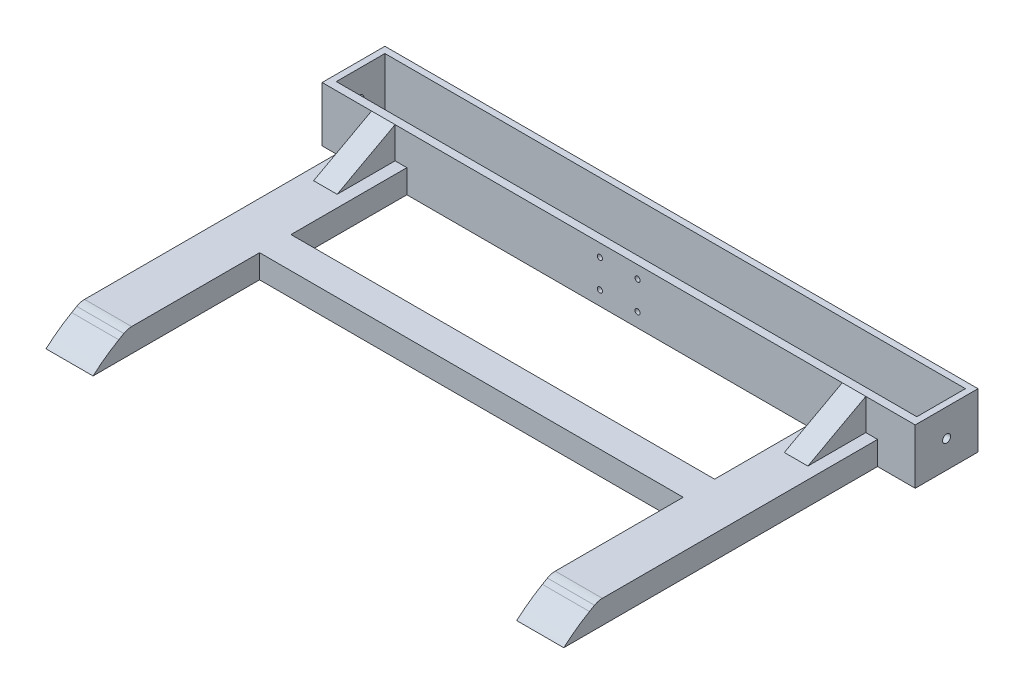
ISO-10303-21;
HEADER;
FILE_DESCRIPTION(('STEP AP214'),'2;1');
FILE_NAME('part.step','',(''),(''),'','','');
FILE_SCHEMA(('AUTOMOTIVE_DESIGN { 1 0 10303 214 1 1 1 1 }'));
ENDSEC;
DATA;
#1=APPLICATION_CONTEXT('core data for automotive mechanical design processes');
#2=APPLICATION_PROTOCOL_DEFINITION('international standard','automotive_design',2000,#1);
#3=PRODUCT_CONTEXT('',#1,'mechanical');
#4=PRODUCT('Part','Part','',(#3));
#5=PRODUCT_RELATED_PRODUCT_CATEGORY('part','',(#4));
#6=PRODUCT_DEFINITION_FORMATION('','',#4);
#7=PRODUCT_DEFINITION_CONTEXT('part definition',#1,'design');
#8=PRODUCT_DEFINITION('design','',#6,#7);
#9=PRODUCT_DEFINITION_SHAPE('','',#8);
#10=(LENGTH_UNIT() NAMED_UNIT(*) SI_UNIT(.MILLI.,.METRE.));
#11=(NAMED_UNIT(*) PLANE_ANGLE_UNIT() SI_UNIT($,.RADIAN.));
#12=(NAMED_UNIT(*) SI_UNIT($,.STERADIAN.) SOLID_ANGLE_UNIT());
#13=UNCERTAINTY_MEASURE_WITH_UNIT(LENGTH_MEASURE(1.E-05),#10,'distance_accuracy_value','');
#14=(GEOMETRIC_REPRESENTATION_CONTEXT(3) GLOBAL_UNCERTAINTY_ASSIGNED_CONTEXT((#13)) GLOBAL_UNIT_ASSIGNED_CONTEXT((#10,
#11,#12)) REPRESENTATION_CONTEXT('',''));
#15=CARTESIAN_POINT('',(0.,0.,0.));
#16=DIRECTION('',(0.,0.,1.));
#17=DIRECTION('',(1.,0.,0.));
#18=AXIS2_PLACEMENT_3D('',#15,#16,#17);
#19=CARTESIAN_POINT('',(0.,0.,2.5));
#20=DIRECTION('',(0.,0.,1.));
#21=DIRECTION('',(1.,0.,0.));
#22=AXIS2_PLACEMENT_3D('',#19,#20,#21);
#23=PLANE('',#22);
#24=CARTESIAN_POINT('',(-12.,9.,2.5));
#25=DIRECTION('',(0.,0.,1.));
#26=DIRECTION('',(1.,0.,0.));
#27=AXIS2_PLACEMENT_3D('',#24,#25,#26);
#28=CIRCLE('',#27,1.65);
#29=CARTESIAN_POINT('',(-10.35,9.,2.5));
#30=VERTEX_POINT('',#29);
#31=EDGE_CURVE('E357',#30,#30,#28,.T.);
#32=ORIENTED_EDGE('',*,*,#31,.F.);
#33=EDGE_LOOP('',(#32));
#34=FACE_BOUND('',#33,.T.);
#35=CARTESIAN_POINT('',(-12.,27.,2.5));
#36=DIRECTION('',(0.,0.,1.));
#37=DIRECTION('',(1.,0.,0.));
#38=AXIS2_PLACEMENT_3D('',#35,#36,#37);
#39=CIRCLE('',#38,1.65);
#40=CARTESIAN_POINT('',(-10.35,27.,2.5));
#41=VERTEX_POINT('',#40);
#42=EDGE_CURVE('E382',#41,#41,#39,.T.);
#43=ORIENTED_EDGE('',*,*,#42,.F.);
#44=EDGE_LOOP('',(#43));
#45=FACE_BOUND('',#44,.T.);
#46=CARTESIAN_POINT('',(12.,9.,2.5));
#47=DIRECTION('',(0.,0.,1.));
#48=DIRECTION('',(1.,0.,0.));
#49=AXIS2_PLACEMENT_3D('',#46,#47,#48);
#50=CIRCLE('',#49,1.65);
#51=CARTESIAN_POINT('',(13.65,9.,2.5));
#52=VERTEX_POINT('',#51);
#53=EDGE_CURVE('E388',#52,#52,#50,.T.);
#54=ORIENTED_EDGE('',*,*,#53,.F.);
#55=EDGE_LOOP('',(#54));
#56=FACE_BOUND('',#55,.T.);
#57=CARTESIAN_POINT('',(12.,27.,2.5));
#58=DIRECTION('',(0.,0.,1.));
#59=DIRECTION('',(1.,0.,0.));
#60=AXIS2_PLACEMENT_3D('',#57,#58,#59);
#61=CIRCLE('',#60,1.65);
#62=CARTESIAN_POINT('',(13.65,27.,2.5));
#63=VERTEX_POINT('',#62);
#64=EDGE_CURVE('E394',#63,#63,#61,.T.);
#65=ORIENTED_EDGE('',*,*,#64,.F.);
#66=EDGE_LOOP('',(#65));
#67=FACE_BOUND('',#66,.T.);
#68=DIRECTION('',(-1.,0.,0.));
#69=VECTOR('',#68,1.);
#70=CARTESIAN_POINT('',(189.,35.0000000000001,2.5));
#71=LINE('',#70,#69);
#72=CARTESIAN_POINT('',(142.5,35.0000000000001,2.5));
#73=VERTEX_POINT('',#72);
#74=CARTESIAN_POINT('',(-142.5,35.,2.5));
#75=VERTEX_POINT('',#74);
#76=EDGE_CURVE('E257',#73,#75,#71,.T.);
#77=ORIENTED_EDGE('',*,*,#76,.T.);
#78=DIRECTION('',(0.,-1.,0.));
#79=VECTOR('',#78,1.);
#80=CARTESIAN_POINT('',(-142.5,0.,2.5));
#81=LINE('',#80,#79);
#82=CARTESIAN_POINT('',(-142.5,15.,2.5));
#83=VERTEX_POINT('',#82);
#84=EDGE_CURVE('E256',#75,#83,#81,.T.);
#85=ORIENTED_EDGE('',*,*,#84,.T.);
#86=DIRECTION('',(-1.,0.,0.));
#87=VECTOR('',#86,1.);
#88=CARTESIAN_POINT('',(-135.,15.,2.5));
#89=LINE('',#88,#87);
#90=CARTESIAN_POINT('',(-135.,15.,2.5));
#91=VERTEX_POINT('',#90);
#92=EDGE_CURVE('E240',#91,#83,#89,.T.);
#93=ORIENTED_EDGE('',*,*,#92,.F.);
#94=DIRECTION('',(0.,1.,0.));
#95=VECTOR('',#94,1.);
#96=CARTESIAN_POINT('',(-135.,15.,2.5));
#97=LINE('',#96,#95);
#98=CARTESIAN_POINT('',(-135.,0.,2.5));
#99=VERTEX_POINT('',#98);
#100=EDGE_CURVE('E370',#99,#91,#97,.T.);
#101=ORIENTED_EDGE('',*,*,#100,.F.);
#102=DIRECTION('',(1.,0.,0.));
#103=VECTOR('',#102,1.);
#104=CARTESIAN_POINT('',(-189.,0.,2.5));
#105=LINE('',#104,#103);
#106=CARTESIAN_POINT('',(135.,0.,2.5));
#107=VERTEX_POINT('',#106);
#108=EDGE_CURVE('E451',#99,#107,#105,.T.);
#109=ORIENTED_EDGE('',*,*,#108,.T.);
#110=DIRECTION('',(0.,-1.,0.));
#111=VECTOR('',#110,1.);
#112=CARTESIAN_POINT('',(135.,15.,2.5));
#113=LINE('',#112,#111);
#114=CARTESIAN_POINT('',(135.,15.,2.5));
#115=VERTEX_POINT('',#114);
#116=EDGE_CURVE('E337',#115,#107,#113,.T.);
#117=ORIENTED_EDGE('',*,*,#116,.F.);
#118=DIRECTION('',(-1.,0.,0.));
#119=VECTOR('',#118,1.);
#120=CARTESIAN_POINT('',(135.,15.,2.5));
#121=LINE('',#120,#119);
#122=CARTESIAN_POINT('',(142.5,15.,2.5));
#123=VERTEX_POINT('',#122);
#124=EDGE_CURVE('E340',#123,#115,#121,.T.);
#125=ORIENTED_EDGE('',*,*,#124,.F.);
#126=DIRECTION('',(0.,1.,0.));
#127=VECTOR('',#126,1.);
#128=CARTESIAN_POINT('',(142.5,0.,2.5));
#129=LINE('',#128,#127);
#130=EDGE_CURVE('E283',#123,#73,#129,.T.);
#131=ORIENTED_EDGE('',*,*,#130,.T.);
#132=EDGE_LOOP('',(#77,#85,#93,#101,#109,#117,#125,#131));
#133=FACE_BOUND('',#132,.T.);
#134=ADVANCED_FACE('F43',(#34,#45,#56,#67,#133),#23,.T.);
#135=DIRECTION('',(0.,-1.,0.));
#136=VECTOR('',#135,1.);
#137=CARTESIAN_POINT('',(-157.5,0.,2.5));
#138=LINE('',#137,#136);
#139=CARTESIAN_POINT('',(-157.5,35.,2.5));
#140=VERTEX_POINT('',#139);
#141=CARTESIAN_POINT('',(-157.5,15.,2.5));
#142=VERTEX_POINT('',#141);
#143=EDGE_CURVE('E58',#140,#142,#138,.T.);
#144=ORIENTED_EDGE('',*,*,#143,.F.);
#145=CARTESIAN_POINT('',(-189.,35.,2.5));
#146=VERTEX_POINT('',#145);
#147=EDGE_CURVE('E440',#140,#146,#71,.T.);
#148=ORIENTED_EDGE('',*,*,#147,.T.);
#149=DIRECTION('',(0.,-1.,0.));
#150=VECTOR('',#149,1.);
#151=CARTESIAN_POINT('',(-189.,0.,2.5));
#152=LINE('',#151,#150);
#153=CARTESIAN_POINT('',(-189.,0.,2.5));
#154=VERTEX_POINT('',#153);
#155=EDGE_CURVE('E445',#146,#154,#152,.T.);
#156=ORIENTED_EDGE('',*,*,#155,.T.);
#157=CARTESIAN_POINT('',(-165.,0.,2.5));
#158=VERTEX_POINT('',#157);
#159=EDGE_CURVE('E448',#154,#158,#105,.T.);
#160=ORIENTED_EDGE('',*,*,#159,.T.);
#161=DIRECTION('',(0.,-1.,0.));
#162=VECTOR('',#161,1.);
#163=CARTESIAN_POINT('',(-165.,15.,2.5));
#164=LINE('',#163,#162);
#165=CARTESIAN_POINT('',(-165.,15.,2.5));
#166=VERTEX_POINT('',#165);
#167=EDGE_CURVE('E372',#166,#158,#164,.T.);
#168=ORIENTED_EDGE('',*,*,#167,.F.);
#169=EDGE_CURVE('E253',#142,#166,#89,.T.);
#170=ORIENTED_EDGE('',*,*,#169,.F.);
#171=EDGE_LOOP('',(#144,#148,#156,#160,#168,#170));
#172=FACE_BOUND('',#171,.T.);
#173=ADVANCED_FACE('F528',(#172),#23,.T.);
#174=CARTESIAN_POINT('',(-135.,15.,202.5));
#175=DIRECTION('',(-1.,0.,0.));
#176=DIRECTION('',(0.,0.,1.));
#177=AXIS2_PLACEMENT_3D('',#174,#175,#176);
#178=PLANE('',#177);
#179=DIRECTION('',(0.,0.,-1.));
#180=VECTOR('',#179,1.);
#181=CARTESIAN_POINT('',(-135.,15.,202.5));
#182=LINE('',#181,#180);
#183=CARTESIAN_POINT('',(-135.,15.,177.914075148194));
#184=VERTEX_POINT('',#183);
#185=CARTESIAN_POINT('',(-135.,15.,96.3824172216684));
#186=VERTEX_POINT('',#185);
#187=EDGE_CURVE('E367',#184,#186,#182,.T.);
#188=ORIENTED_EDGE('',*,*,#187,.F.);
#189=CARTESIAN_POINT('',(-135.,5.00000000000003,177.914075148194));
#190=DIRECTION('',(-1.,0.,0.));
#191=DIRECTION('',(0.,0.,1.));
#192=AXIS2_PLACEMENT_3D('',#189,#190,#191);
#193=CIRCLE('',#192,10.);
#194=CARTESIAN_POINT('',(-135.,13.6602540378445,182.914075148194));
#195=VERTEX_POINT('',#194);
#196=EDGE_CURVE('E488',#184,#195,#193,.F.);
#197=ORIENTED_EDGE('',*,*,#196,.T.);
#198=DIRECTION('',(0.,0.499999999999995,-0.866025403784442));
#199=VECTOR('',#198,1.);
#200=CARTESIAN_POINT('',(-135.,5.51423628924494,197.023391768126));
#201=LINE('',#200,#199);
#202=CARTESIAN_POINT('',(-135.,11.8051884231915,186.127143044147));
#203=VERTEX_POINT('',#202);
#204=EDGE_CURVE('E300',#203,#195,#201,.T.);
#205=ORIENTED_EDGE('',*,*,#204,.F.);
#206=CARTESIAN_POINT('',(-135.,-74.7973519552528,136.127143044148));
#207=DIRECTION('',(-1.,0.,0.));
#208=DIRECTION('',(0.,0.,1.));
#209=AXIS2_PLACEMENT_3D('',#206,#207,#208);
#210=CIRCLE('',#209,100.);
#211=CARTESIAN_POINT('',(-135.,0.,202.5));
#212=VERTEX_POINT('',#211);
#213=EDGE_CURVE('E469',#203,#212,#210,.F.);
#214=ORIENTED_EDGE('',*,*,#213,.T.);
#215=DIRECTION('',(0.,0.,-1.));
#216=VECTOR('',#215,1.);
#217=CARTESIAN_POINT('',(-135.,0.,202.5));
#218=LINE('',#217,#216);
#219=CARTESIAN_POINT('',(-135.,0.,96.3824172216684));
#220=VERTEX_POINT('',#219);
#221=EDGE_CURVE('E364',#212,#220,#218,.T.);
#222=ORIENTED_EDGE('',*,*,#221,.T.);
#223=DIRECTION('',(0.,-1.,0.));
#224=VECTOR('',#223,1.);
#225=CARTESIAN_POINT('',(-135.,15.,96.3824172216684));
#226=LINE('',#225,#224);
#227=EDGE_CURVE('E316',#186,#220,#226,.T.);
#228=ORIENTED_EDGE('',*,*,#227,.F.);
#229=EDGE_LOOP('',(#188,#197,#205,#214,#222,#228));
#230=FACE_BOUND('',#229,.T.);
#231=ADVANCED_FACE('F534',(#230),#178,.F.);
#232=CARTESIAN_POINT('',(135.,15.,202.5));
#233=DIRECTION('',(1.,0.,0.));
#234=DIRECTION('',(0.,0.,-1.));
#235=AXIS2_PLACEMENT_3D('',#232,#233,#234);
#236=PLANE('',#235);
#237=DIRECTION('',(0.,-0.499999999999995,0.866025403784442));
#238=VECTOR('',#237,1.);
#239=CARTESIAN_POINT('',(135.,5.51423628924494,197.023391768126));
#240=LINE('',#239,#238);
#241=CARTESIAN_POINT('',(135.,13.6602540378445,182.914075148194));
#242=VERTEX_POINT('',#241);
#243=CARTESIAN_POINT('',(135.,11.8051884231915,186.127143044147));
#244=VERTEX_POINT('',#243);
#245=EDGE_CURVE('E298',#242,#244,#240,.T.);
#246=ORIENTED_EDGE('',*,*,#245,.F.);
#247=CARTESIAN_POINT('',(135.,5.00000000000003,177.914075148194));
#248=DIRECTION('',(1.,0.,0.));
#249=DIRECTION('',(0.,0.,-1.));
#250=AXIS2_PLACEMENT_3D('',#247,#248,#249);
#251=CIRCLE('',#250,10.);
#252=CARTESIAN_POINT('',(135.,15.,177.914075148194));
#253=VERTEX_POINT('',#252);
#254=EDGE_CURVE('E498',#242,#253,#251,.F.);
#255=ORIENTED_EDGE('',*,*,#254,.T.);
#256=DIRECTION('',(0.,0.,-1.));
#257=VECTOR('',#256,1.);
#258=CARTESIAN_POINT('',(135.,15.,202.5));
#259=LINE('',#258,#257);
#260=CARTESIAN_POINT('',(135.,15.,96.3824172216684));
#261=VERTEX_POINT('',#260);
#262=EDGE_CURVE('E353',#253,#261,#259,.T.);
#263=ORIENTED_EDGE('',*,*,#262,.T.);
#264=DIRECTION('',(0.,-1.,0.));
#265=VECTOR('',#264,1.);
#266=CARTESIAN_POINT('',(135.,15.,96.3824172216684));
#267=LINE('',#266,#265);
#268=CARTESIAN_POINT('',(135.,0.,96.3824172216684));
#269=VERTEX_POINT('',#268);
#270=EDGE_CURVE('E324',#261,#269,#267,.T.);
#271=ORIENTED_EDGE('',*,*,#270,.T.);
#272=DIRECTION('',(0.,0.,-1.));
#273=VECTOR('',#272,1.);
#274=CARTESIAN_POINT('',(135.,0.,202.5));
#275=LINE('',#274,#273);
#276=CARTESIAN_POINT('',(135.,0.,202.5));
#277=VERTEX_POINT('',#276);
#278=EDGE_CURVE('E349',#277,#269,#275,.T.);
#279=ORIENTED_EDGE('',*,*,#278,.F.);
#280=CARTESIAN_POINT('',(135.,-74.7973519552527,136.127143044148));
#281=DIRECTION('',(1.,0.,0.));
#282=DIRECTION('',(0.,0.,-1.));
#283=AXIS2_PLACEMENT_3D('',#280,#281,#282);
#284=CIRCLE('',#283,100.);
#285=EDGE_CURVE('E479',#277,#244,#284,.F.);
#286=ORIENTED_EDGE('',*,*,#285,.T.);
#287=EDGE_LOOP('',(#246,#255,#263,#271,#279,#286));
#288=FACE_BOUND('',#287,.T.);
#289=ADVANCED_FACE('F694',(#288),#236,.F.);
#290=CARTESIAN_POINT('',(-165.,15.,202.5));
#291=DIRECTION('',(1.,0.,0.));
#292=DIRECTION('',(0.,0.,-1.));
#293=AXIS2_PLACEMENT_3D('',#290,#291,#292);
#294=PLANE('',#293);
#295=DIRECTION('',(0.,-0.499999999999995,0.866025403784442));
#296=VECTOR('',#295,1.);
#297=CARTESIAN_POINT('',(-165.,5.51423628924494,197.023391768126));
#298=LINE('',#297,#296);
#299=CARTESIAN_POINT('',(-165.,13.6602540378445,182.914075148194));
#300=VERTEX_POINT('',#299);
#301=CARTESIAN_POINT('',(-165.,11.8051884231915,186.127143044147));
#302=VERTEX_POINT('',#301);
#303=EDGE_CURVE('E296',#300,#302,#298,.T.);
#304=ORIENTED_EDGE('',*,*,#303,.F.);
#305=CARTESIAN_POINT('',(-165.,5.00000000000003,177.914075148194));
#306=DIRECTION('',(1.,0.,0.));
#307=DIRECTION('',(0.,0.,-1.));
#308=AXIS2_PLACEMENT_3D('',#305,#306,#307);
#309=CIRCLE('',#308,10.);
#310=CARTESIAN_POINT('',(-165.,15.,177.914075148194));
#311=VERTEX_POINT('',#310);
#312=EDGE_CURVE('E492',#300,#311,#309,.F.);
#313=ORIENTED_EDGE('',*,*,#312,.T.);
#314=DIRECTION('',(0.,0.,-1.));
#315=VECTOR('',#314,1.);
#316=CARTESIAN_POINT('',(-165.,15.,202.5));
#317=LINE('',#316,#315);
#318=EDGE_CURVE('E320',#311,#166,#317,.T.);
#319=ORIENTED_EDGE('',*,*,#318,.T.);
#320=ORIENTED_EDGE('',*,*,#167,.T.);
#321=DIRECTION('',(0.,0.,-1.));
#322=VECTOR('',#321,1.);
#323=CARTESIAN_POINT('',(-165.,0.,202.5));
#324=LINE('',#323,#322);
#325=CARTESIAN_POINT('',(-165.,0.,202.5));
#326=VERTEX_POINT('',#325);
#327=EDGE_CURVE('E360',#326,#158,#324,.T.);
#328=ORIENTED_EDGE('',*,*,#327,.F.);
#329=CARTESIAN_POINT('',(-165.,-74.7973519552528,136.127143044148));
#330=DIRECTION('',(1.,0.,0.));
#331=DIRECTION('',(0.,0.,-1.));
#332=AXIS2_PLACEMENT_3D('',#329,#330,#331);
#333=CIRCLE('',#332,100.);
#334=EDGE_CURVE('E471',#326,#302,#333,.F.);
#335=ORIENTED_EDGE('',*,*,#334,.T.);
#336=EDGE_LOOP('',(#304,#313,#319,#320,#328,#335));
#337=FACE_BOUND('',#336,.T.);
#338=ADVANCED_FACE('F590',(#337),#294,.F.);
#339=CARTESIAN_POINT('',(165.,15.,202.5));
#340=DIRECTION('',(-1.,0.,0.));
#341=DIRECTION('',(0.,0.,1.));
#342=AXIS2_PLACEMENT_3D('',#339,#340,#341);
#343=PLANE('',#342);
#344=DIRECTION('',(0.,0.,-1.));
#345=VECTOR('',#344,1.);
#346=CARTESIAN_POINT('',(165.,15.,202.5));
#347=LINE('',#346,#345);
#348=CARTESIAN_POINT('',(165.,15.,177.914075148194));
#349=VERTEX_POINT('',#348);
#350=CARTESIAN_POINT('',(165.,15.,2.5));
#351=VERTEX_POINT('',#350);
#352=EDGE_CURVE('E355',#349,#351,#347,.T.);
#353=ORIENTED_EDGE('',*,*,#352,.F.);
#354=CARTESIAN_POINT('',(165.,5.00000000000003,177.914075148194));
#355=DIRECTION('',(-1.,0.,0.));
#356=DIRECTION('',(0.,0.,1.));
#357=AXIS2_PLACEMENT_3D('',#354,#355,#356);
#358=CIRCLE('',#357,10.);
#359=CARTESIAN_POINT('',(165.,13.6602540378445,182.914075148194));
#360=VERTEX_POINT('',#359);
#361=EDGE_CURVE('E494',#349,#360,#358,.F.);
#362=ORIENTED_EDGE('',*,*,#361,.T.);
#363=DIRECTION('',(0.,0.499999999999995,-0.866025403784442));
#364=VECTOR('',#363,1.);
#365=CARTESIAN_POINT('',(165.,5.51423628924494,197.023391768126));
#366=LINE('',#365,#364);
#367=CARTESIAN_POINT('',(165.,11.8051884231915,186.127143044147));
#368=VERTEX_POINT('',#367);
#369=EDGE_CURVE('E293',#368,#360,#366,.T.);
#370=ORIENTED_EDGE('',*,*,#369,.F.);
#371=CARTESIAN_POINT('',(165.,-74.7973519552527,136.127143044148));
#372=DIRECTION('',(-1.,0.,0.));
#373=DIRECTION('',(0.,0.,1.));
#374=AXIS2_PLACEMENT_3D('',#371,#372,#373);
#375=CIRCLE('',#374,100.);
#376=CARTESIAN_POINT('',(165.,0.,202.5));
#377=VERTEX_POINT('',#376);
#378=EDGE_CURVE('E477',#368,#377,#375,.F.);
#379=ORIENTED_EDGE('',*,*,#378,.T.);
#380=DIRECTION('',(0.,0.,-1.));
#381=VECTOR('',#380,1.);
#382=CARTESIAN_POINT('',(165.,0.,202.5));
#383=LINE('',#382,#381);
#384=CARTESIAN_POINT('',(165.,0.,2.5));
#385=VERTEX_POINT('',#384);
#386=EDGE_CURVE('E336',#377,#385,#383,.T.);
#387=ORIENTED_EDGE('',*,*,#386,.T.);
#388=DIRECTION('',(0.,1.,0.));
#389=VECTOR('',#388,1.);
#390=CARTESIAN_POINT('',(165.,15.,2.5));
#391=LINE('',#390,#389);
#392=EDGE_CURVE('E252',#385,#351,#391,.T.);
#393=ORIENTED_EDGE('',*,*,#392,.T.);
#394=EDGE_LOOP('',(#353,#362,#370,#379,#387,#393));
#395=FACE_BOUND('',#394,.T.);
#396=ADVANCED_FACE('F715',(#395),#343,.F.);
#397=CARTESIAN_POINT('',(-185.,0.,-37.5));
#398=DIRECTION('',(-1.,0.,0.));
#399=DIRECTION('',(0.,0.,1.));
#400=AXIS2_PLACEMENT_3D('',#397,#398,#399);
#401=PLANE('',#400);
#402=CARTESIAN_POINT('',(-185.,17.5000000000001,-17.5));
#403=DIRECTION('',(-1.,0.,0.));
#404=DIRECTION('',(0.,0.,1.));
#405=AXIS2_PLACEMENT_3D('',#402,#403,#404);
#406=CIRCLE('',#405,2.55);
#407=CARTESIAN_POINT('',(-185.,17.5000000000001,-14.95));
#408=VERTEX_POINT('',#407);
#409=EDGE_CURVE('E407',#408,#408,#406,.T.);
#410=ORIENTED_EDGE('',*,*,#409,.T.);
#411=EDGE_LOOP('',(#410));
#412=FACE_BOUND('',#411,.T.);
#413=DIRECTION('',(0.,1.,0.));
#414=VECTOR('',#413,1.);
#415=CARTESIAN_POINT('',(-185.,0.,-33.5));
#416=LINE('',#415,#414);
#417=CARTESIAN_POINT('',(-185.,0.,-33.5));
#418=VERTEX_POINT('',#417);
#419=CARTESIAN_POINT('',(-185.,35.0000000000001,-33.5));
#420=VERTEX_POINT('',#419);
#421=EDGE_CURVE('E310',#418,#420,#416,.T.);
#422=ORIENTED_EDGE('',*,*,#421,.T.);
#423=DIRECTION('',(0.,0.,1.));
#424=VECTOR('',#423,1.);
#425=CARTESIAN_POINT('',(-185.,35.0000000000001,-37.5));
#426=LINE('',#425,#424);
#427=CARTESIAN_POINT('',(-185.,35.,-2.5));
#428=VERTEX_POINT('',#427);
#429=EDGE_CURVE('E410',#420,#428,#426,.T.);
#430=ORIENTED_EDGE('',*,*,#429,.T.);
#431=DIRECTION('',(0.,-1.,0.));
#432=VECTOR('',#431,1.);
#433=CARTESIAN_POINT('',(-185.,0.,-2.5));
#434=LINE('',#433,#432);
#435=CARTESIAN_POINT('',(-185.,0.,-2.5));
#436=VERTEX_POINT('',#435);
#437=EDGE_CURVE('E422',#428,#436,#434,.T.);
#438=ORIENTED_EDGE('',*,*,#437,.T.);
#439=DIRECTION('',(0.,0.,1.));
#440=VECTOR('',#439,1.);
#441=CARTESIAN_POINT('',(-185.,0.,-37.5));
#442=LINE('',#441,#440);
#443=EDGE_CURVE('E430',#418,#436,#442,.T.);
#444=ORIENTED_EDGE('',*,*,#443,.F.);
#445=EDGE_LOOP('',(#422,#430,#438,#444));
#446=FACE_BOUND('',#445,.T.);
#447=ADVANCED_FACE('F722',(#412,#446),#401,.F.);
#448=CARTESIAN_POINT('',(185.,0.,-37.5));
#449=DIRECTION('',(1.,0.,0.));
#450=DIRECTION('',(0.,0.,-1.));
#451=AXIS2_PLACEMENT_3D('',#448,#449,#450);
#452=PLANE('',#451);
#453=CARTESIAN_POINT('',(185.,17.5000000000001,-17.5));
#454=DIRECTION('',(1.,0.,0.));
#455=DIRECTION('',(0.,0.,-1.));
#456=AXIS2_PLACEMENT_3D('',#453,#454,#455);
#457=CIRCLE('',#456,2.55);
#458=CARTESIAN_POINT('',(185.,17.5000000000001,-20.05));
#459=VERTEX_POINT('',#458);
#460=EDGE_CURVE('E404',#459,#459,#457,.T.);
#461=ORIENTED_EDGE('',*,*,#460,.T.);
#462=EDGE_LOOP('',(#461));
#463=FACE_BOUND('',#462,.T.);
#464=DIRECTION('',(0.,1.,0.));
#465=VECTOR('',#464,1.);
#466=CARTESIAN_POINT('',(185.,0.,-33.5));
#467=LINE('',#466,#465);
#468=CARTESIAN_POINT('',(185.,0.,-33.5));
#469=VERTEX_POINT('',#468);
#470=CARTESIAN_POINT('',(185.,35.0000000000001,-33.5));
#471=VERTEX_POINT('',#470);
#472=EDGE_CURVE('E303',#469,#471,#467,.T.);
#473=ORIENTED_EDGE('',*,*,#472,.F.);
#474=DIRECTION('',(0.,0.,1.));
#475=VECTOR('',#474,1.);
#476=CARTESIAN_POINT('',(185.,0.,-37.5));
#477=LINE('',#476,#475);
#478=CARTESIAN_POINT('',(185.,0.,-2.5));
#479=VERTEX_POINT('',#478);
#480=EDGE_CURVE('E424',#469,#479,#477,.T.);
#481=ORIENTED_EDGE('',*,*,#480,.T.);
#482=DIRECTION('',(0.,1.,0.));
#483=VECTOR('',#482,1.);
#484=CARTESIAN_POINT('',(185.,0.,-2.5));
#485=LINE('',#484,#483);
#486=CARTESIAN_POINT('',(185.,35.0000000000001,-2.5));
#487=VERTEX_POINT('',#486);
#488=EDGE_CURVE('E414',#479,#487,#485,.T.);
#489=ORIENTED_EDGE('',*,*,#488,.T.);
#490=DIRECTION('',(0.,0.,1.));
#491=VECTOR('',#490,1.);
#492=CARTESIAN_POINT('',(185.,35.0000000000001,-37.5));
#493=LINE('',#492,#491);
#494=EDGE_CURVE('E419',#471,#487,#493,.T.);
#495=ORIENTED_EDGE('',*,*,#494,.F.);
#496=EDGE_LOOP('',(#473,#481,#489,#495));
#497=FACE_BOUND('',#496,.T.);
#498=ADVANCED_FACE('F878',(#463,#497),#452,.F.);
#499=DIRECTION('',(0.,1.,0.));
#500=VECTOR('',#499,1.);
#501=CARTESIAN_POINT('',(-135.,15.,76.3824172216684));
#502=LINE('',#501,#500);
#503=CARTESIAN_POINT('',(-135.,0.,76.3824172216684));
#504=VERTEX_POINT('',#503);
#505=CARTESIAN_POINT('',(-135.,15.,76.3824172216684));
#506=VERTEX_POINT('',#505);
#507=EDGE_CURVE('E314',#504,#506,#502,.T.);
#508=ORIENTED_EDGE('',*,*,#507,.F.);
#509=EDGE_CURVE('E363',#504,#99,#218,.T.);
#510=ORIENTED_EDGE('',*,*,#509,.T.);
#511=ORIENTED_EDGE('',*,*,#100,.T.);
#512=EDGE_CURVE('E248',#506,#91,#182,.T.);
#513=ORIENTED_EDGE('',*,*,#512,.F.);
#514=EDGE_LOOP('',(#508,#510,#511,#513));
#515=FACE_BOUND('',#514,.T.);
#516=ADVANCED_FACE('F697',(#515),#178,.F.);
#517=DIRECTION('',(0.,1.,0.));
#518=VECTOR('',#517,1.);
#519=CARTESIAN_POINT('',(135.,15.,76.3824172216684));
#520=LINE('',#519,#518);
#521=CARTESIAN_POINT('',(135.,0.,76.3824172216684));
#522=VERTEX_POINT('',#521);
#523=CARTESIAN_POINT('',(135.,15.,76.3824172216684));
#524=VERTEX_POINT('',#523);
#525=EDGE_CURVE('E313',#522,#524,#520,.T.);
#526=ORIENTED_EDGE('',*,*,#525,.T.);
#527=EDGE_CURVE('E352',#524,#115,#259,.T.);
#528=ORIENTED_EDGE('',*,*,#527,.T.);
#529=ORIENTED_EDGE('',*,*,#116,.T.);
#530=EDGE_CURVE('E348',#522,#107,#275,.T.);
#531=ORIENTED_EDGE('',*,*,#530,.F.);
#532=EDGE_LOOP('',(#526,#528,#529,#531));
#533=FACE_BOUND('',#532,.T.);
#534=ADVANCED_FACE('F707',(#533),#236,.F.);
#535=CARTESIAN_POINT('',(0.,0.,-2.5));
#536=DIRECTION('',(0.,0.,1.));
#537=DIRECTION('',(1.,0.,0.));
#538=AXIS2_PLACEMENT_3D('',#535,#536,#537);
#539=PLANE('',#538);
#540=ORIENTED_EDGE('',*,*,#437,.F.);
#541=DIRECTION('',(-1.,0.,0.));
#542=VECTOR('',#541,1.);
#543=CARTESIAN_POINT('',(189.,35.0000000000001,-2.5));
#544=LINE('',#543,#542);
#545=EDGE_CURVE('E427',#487,#428,#544,.T.);
#546=ORIENTED_EDGE('',*,*,#545,.F.);
#547=ORIENTED_EDGE('',*,*,#488,.F.);
#548=DIRECTION('',(1.,0.,0.));
#549=VECTOR('',#548,1.);
#550=CARTESIAN_POINT('',(-189.,0.,-2.5));
#551=LINE('',#550,#549);
#552=EDGE_CURVE('E441',#436,#479,#551,.T.);
#553=ORIENTED_EDGE('',*,*,#552,.F.);
#554=EDGE_LOOP('',(#540,#546,#547,#553));
#555=FACE_BOUND('',#554,.T.);
#556=CARTESIAN_POINT('',(-12.,9.,-2.5));
#557=DIRECTION('',(0.,0.,1.));
#558=DIRECTION('',(1.,0.,0.));
#559=AXIS2_PLACEMENT_3D('',#556,#557,#558);
#560=CIRCLE('',#559,1.65);
#561=CARTESIAN_POINT('',(-10.35,9.,-2.5));
#562=VERTEX_POINT('',#561);
#563=EDGE_CURVE('E379',#562,#562,#560,.T.);
#564=ORIENTED_EDGE('',*,*,#563,.T.);
#565=EDGE_LOOP('',(#564));
#566=FACE_BOUND('',#565,.T.);
#567=CARTESIAN_POINT('',(-12.,27.,-2.5));
#568=DIRECTION('',(0.,0.,1.));
#569=DIRECTION('',(1.,0.,0.));
#570=AXIS2_PLACEMENT_3D('',#567,#568,#569);
#571=CIRCLE('',#570,1.65);
#572=CARTESIAN_POINT('',(-10.35,27.,-2.5));
#573=VERTEX_POINT('',#572);
#574=EDGE_CURVE('E385',#573,#573,#571,.T.);
#575=ORIENTED_EDGE('',*,*,#574,.T.);
#576=EDGE_LOOP('',(#575));
#577=FACE_BOUND('',#576,.T.);
#578=CARTESIAN_POINT('',(12.,9.,-2.5));
#579=DIRECTION('',(0.,0.,1.));
#580=DIRECTION('',(1.,0.,0.));
#581=AXIS2_PLACEMENT_3D('',#578,#579,#580);
#582=CIRCLE('',#581,1.65);
#583=CARTESIAN_POINT('',(13.65,9.,-2.5));
#584=VERTEX_POINT('',#583);
#585=EDGE_CURVE('E391',#584,#584,#582,.T.);
#586=ORIENTED_EDGE('',*,*,#585,.T.);
#587=EDGE_LOOP('',(#586));
#588=FACE_BOUND('',#587,.T.);
#589=CARTESIAN_POINT('',(12.,27.,-2.5));
#590=DIRECTION('',(0.,0.,1.));
#591=DIRECTION('',(1.,0.,0.));
#592=AXIS2_PLACEMENT_3D('',#589,#590,#591);
#593=CIRCLE('',#592,1.65);
#594=CARTESIAN_POINT('',(13.65,27.,-2.5));
#595=VERTEX_POINT('',#594);
#596=EDGE_CURVE('E397',#595,#595,#593,.T.);
#597=ORIENTED_EDGE('',*,*,#596,.T.);
#598=EDGE_LOOP('',(#597));
#599=FACE_BOUND('',#598,.T.);
#600=ADVANCED_FACE('F561',(#555,#566,#577,#588,#599),#539,.F.);
#601=CARTESIAN_POINT('',(189.,0.,2.5));
#602=DIRECTION('',(-1.,0.,0.));
#603=DIRECTION('',(0.,0.,1.));
#604=AXIS2_PLACEMENT_3D('',#601,#602,#603);
#605=PLANE('',#604);
#606=CARTESIAN_POINT('',(189.,17.5000000000001,-17.5));
#607=DIRECTION('',(1.,0.,0.));
#608=DIRECTION('',(0.,0.,-1.));
#609=AXIS2_PLACEMENT_3D('',#606,#607,#608);
#610=CIRCLE('',#609,2.55);
#611=CARTESIAN_POINT('',(189.,17.5000000000001,-20.05));
#612=VERTEX_POINT('',#611);
#613=EDGE_CURVE('E400',#612,#612,#610,.T.);
#614=ORIENTED_EDGE('',*,*,#613,.F.);
#615=EDGE_LOOP('',(#614));
#616=FACE_BOUND('',#615,.T.);
#617=DIRECTION('',(0.,0.,-1.));
#618=VECTOR('',#617,1.);
#619=CARTESIAN_POINT('',(189.,0.,2.5));
#620=LINE('',#619,#618);
#621=CARTESIAN_POINT('',(189.,0.,2.5));
#622=VERTEX_POINT('',#621);
#623=CARTESIAN_POINT('',(189.,0.,-37.5));
#624=VERTEX_POINT('',#623);
#625=EDGE_CURVE('E450',#622,#624,#620,.T.);
#626=ORIENTED_EDGE('',*,*,#625,.T.);
#627=DIRECTION('',(0.,-1.,0.));
#628=VECTOR('',#627,1.);
#629=CARTESIAN_POINT('',(189.,0.,-37.5));
#630=LINE('',#629,#628);
#631=CARTESIAN_POINT('',(189.,35.0000000000001,-37.5));
#632=VERTEX_POINT('',#631);
#633=EDGE_CURVE('E416',#632,#624,#630,.T.);
#634=ORIENTED_EDGE('',*,*,#633,.F.);
#635=DIRECTION('',(0.,0.,-1.));
#636=VECTOR('',#635,1.);
#637=CARTESIAN_POINT('',(189.,35.0000000000001,2.5));
#638=LINE('',#637,#636);
#639=CARTESIAN_POINT('',(189.,35.0000000000001,2.5));
#640=VERTEX_POINT('',#639);
#641=EDGE_CURVE('E461',#640,#632,#638,.T.);
#642=ORIENTED_EDGE('',*,*,#641,.F.);
#643=DIRECTION('',(0.,1.,0.));
#644=VECTOR('',#643,1.);
#645=CARTESIAN_POINT('',(189.,0.,2.5));
#646=LINE('',#645,#644);
#647=EDGE_CURVE('E437',#622,#640,#646,.T.);
#648=ORIENTED_EDGE('',*,*,#647,.F.);
#649=EDGE_LOOP('',(#626,#634,#642,#648));
#650=FACE_BOUND('',#649,.T.);
#651=ADVANCED_FACE('F564',(#616,#650),#605,.F.);
#652=CARTESIAN_POINT('',(189.,35.0000000000001,2.5));
#653=DIRECTION('',(0.,-1.,0.));
#654=DIRECTION('',(1.,0.,0.));
#655=AXIS2_PLACEMENT_3D('',#652,#653,#654);
#656=PLANE('',#655);
#657=ORIENTED_EDGE('',*,*,#545,.T.);
#658=ORIENTED_EDGE('',*,*,#429,.F.);
#659=DIRECTION('',(1.,0.,0.));
#660=VECTOR('',#659,1.);
#661=CARTESIAN_POINT('',(-189.002,35.0000000000001,-33.5));
#662=LINE('',#661,#660);
#663=EDGE_CURVE('E306',#420,#471,#662,.T.);
#664=ORIENTED_EDGE('',*,*,#663,.T.);
#665=ORIENTED_EDGE('',*,*,#494,.T.);
#666=EDGE_LOOP('',(#657,#658,#664,#665));
#667=FACE_BOUND('',#666,.T.);
#668=ORIENTED_EDGE('',*,*,#147,.F.);
#669=DIRECTION('',(1.,0.,0.));
#670=VECTOR('',#669,1.);
#671=CARTESIAN_POINT('',(189.,35.0000000000001,2.5));
#672=LINE('',#671,#670);
#673=EDGE_CURVE('E65',#75,#140,#672,.F.);
#674=ORIENTED_EDGE('',*,*,#673,.F.);
#675=ORIENTED_EDGE('',*,*,#76,.F.);
#676=DIRECTION('',(-1.,0.,0.));
#677=VECTOR('',#676,1.);
#678=CARTESIAN_POINT('',(0.,35.0000000000001,2.5));
#679=LINE('',#678,#677);
#680=CARTESIAN_POINT('',(157.5,35.0000000000001,2.5));
#681=VERTEX_POINT('',#680);
#682=EDGE_CURVE('E290',#681,#73,#679,.T.);
#683=ORIENTED_EDGE('',*,*,#682,.F.);
#684=EDGE_CURVE('E442',#640,#681,#71,.T.);
#685=ORIENTED_EDGE('',*,*,#684,.F.);
#686=ORIENTED_EDGE('',*,*,#641,.T.);
#687=DIRECTION('',(1.,0.,0.));
#688=VECTOR('',#687,1.);
#689=CARTESIAN_POINT('',(189.,35.0000000000001,-37.5));
#690=LINE('',#689,#688);
#691=CARTESIAN_POINT('',(-189.,35.0000000000001,-37.5));
#692=VERTEX_POINT('',#691);
#693=EDGE_CURVE('E413',#692,#632,#690,.T.);
#694=ORIENTED_EDGE('',*,*,#693,.F.);
#695=DIRECTION('',(0.,0.,-1.));
#696=VECTOR('',#695,1.);
#697=CARTESIAN_POINT('',(-189.,35.,2.5));
#698=LINE('',#697,#696);
#699=EDGE_CURVE('E458',#146,#692,#698,.T.);
#700=ORIENTED_EDGE('',*,*,#699,.F.);
#701=EDGE_LOOP('',(#668,#674,#675,#683,#685,#686,#694,#700));
#702=FACE_BOUND('',#701,.T.);
#703=ADVANCED_FACE('F509',(#667,#702),#656,.F.);
#704=CARTESIAN_POINT('',(-189.,0.,2.5));
#705=DIRECTION('',(1.,0.,0.));
#706=DIRECTION('',(0.,0.,-1.));
#707=AXIS2_PLACEMENT_3D('',#704,#705,#706);
#708=PLANE('',#707);
#709=CARTESIAN_POINT('',(-189.,17.5000000000001,-17.5));
#710=DIRECTION('',(1.,0.,0.));
#711=DIRECTION('',(0.,0.,-1.));
#712=AXIS2_PLACEMENT_3D('',#709,#710,#711);
#713=CIRCLE('',#712,2.55);
#714=CARTESIAN_POINT('',(-189.,17.5000000000001,-20.05));
#715=VERTEX_POINT('',#714);
#716=EDGE_CURVE('E401',#715,#715,#713,.T.);
#717=ORIENTED_EDGE('',*,*,#716,.T.);
#718=EDGE_LOOP('',(#717));
#719=FACE_BOUND('',#718,.T.);
#720=ORIENTED_EDGE('',*,*,#699,.T.);
#721=DIRECTION('',(0.,1.,0.));
#722=VECTOR('',#721,1.);
#723=CARTESIAN_POINT('',(-189.,0.,-37.5));
#724=LINE('',#723,#722);
#725=CARTESIAN_POINT('',(-189.,0.,-37.5));
#726=VERTEX_POINT('',#725);
#727=EDGE_CURVE('E432',#726,#692,#724,.T.);
#728=ORIENTED_EDGE('',*,*,#727,.F.);
#729=DIRECTION('',(0.,0.,-1.));
#730=VECTOR('',#729,1.);
#731=CARTESIAN_POINT('',(-189.,0.,2.5));
#732=LINE('',#731,#730);
#733=EDGE_CURVE('E455',#154,#726,#732,.T.);
#734=ORIENTED_EDGE('',*,*,#733,.F.);
#735=ORIENTED_EDGE('',*,*,#155,.F.);
#736=EDGE_LOOP('',(#720,#728,#734,#735));
#737=FACE_BOUND('',#736,.T.);
#738=ADVANCED_FACE('F550',(#719,#737),#708,.F.);
#739=CARTESIAN_POINT('',(-189.,0.,2.5));
#740=DIRECTION('',(0.,1.,0.));
#741=DIRECTION('',(-1.,0.,0.));
#742=AXIS2_PLACEMENT_3D('',#739,#740,#741);
#743=PLANE('',#742);
#744=ORIENTED_EDGE('',*,*,#480,.F.);
#745=DIRECTION('',(1.,0.,0.));
#746=VECTOR('',#745,1.);
#747=CARTESIAN_POINT('',(-189.002,0.,-33.5));
#748=LINE('',#747,#746);
#749=EDGE_CURVE('E308',#418,#469,#748,.T.);
#750=ORIENTED_EDGE('',*,*,#749,.F.);
#751=ORIENTED_EDGE('',*,*,#443,.T.);
#752=ORIENTED_EDGE('',*,*,#552,.T.);
#753=EDGE_LOOP('',(#744,#750,#751,#752));
#754=FACE_BOUND('',#753,.T.);
#755=ORIENTED_EDGE('',*,*,#733,.T.);
#756=DIRECTION('',(-1.,0.,0.));
#757=VECTOR('',#756,1.);
#758=CARTESIAN_POINT('',(189.,0.,-37.5));
#759=LINE('',#758,#757);
#760=EDGE_CURVE('E411',#624,#726,#759,.T.);
#761=ORIENTED_EDGE('',*,*,#760,.F.);
#762=ORIENTED_EDGE('',*,*,#625,.F.);
#763=EDGE_CURVE('E447',#385,#622,#105,.T.);
#764=ORIENTED_EDGE('',*,*,#763,.F.);
#765=ORIENTED_EDGE('',*,*,#386,.F.);
#766=DIRECTION('',(1.,0.,0.));
#767=VECTOR('',#766,1.);
#768=CARTESIAN_POINT('',(135.,0.,202.5));
#769=LINE('',#768,#767);
#770=EDGE_CURVE('E333',#277,#377,#769,.T.);
#771=ORIENTED_EDGE('',*,*,#770,.F.);
#772=ORIENTED_EDGE('',*,*,#278,.T.);
#773=DIRECTION('',(-1.,0.,0.));
#774=VECTOR('',#773,1.);
#775=CARTESIAN_POINT('',(189.002,0.,96.3824172216684));
#776=LINE('',#775,#774);
#777=EDGE_CURVE('E321',#269,#220,#776,.T.);
#778=ORIENTED_EDGE('',*,*,#777,.T.);
#779=ORIENTED_EDGE('',*,*,#221,.F.);
#780=DIRECTION('',(1.,0.,0.));
#781=VECTOR('',#780,1.);
#782=CARTESIAN_POINT('',(-135.,0.,202.5));
#783=LINE('',#782,#781);
#784=EDGE_CURVE('E369',#326,#212,#783,.T.);
#785=ORIENTED_EDGE('',*,*,#784,.F.);
#786=ORIENTED_EDGE('',*,*,#327,.T.);
#787=ORIENTED_EDGE('',*,*,#159,.F.);
#788=EDGE_LOOP('',(#755,#761,#762,#764,#765,#771,#772,#778,#779,#785,#786,#787));
#789=FACE_BOUND('',#788,.T.);
#790=ORIENTED_EDGE('',*,*,#509,.F.);
#791=DIRECTION('',(-1.,0.,0.));
#792=VECTOR('',#791,1.);
#793=CARTESIAN_POINT('',(189.002,0.,76.3824172216684));
#794=LINE('',#793,#792);
#795=EDGE_CURVE('E323',#522,#504,#794,.T.);
#796=ORIENTED_EDGE('',*,*,#795,.F.);
#797=ORIENTED_EDGE('',*,*,#530,.T.);
#798=ORIENTED_EDGE('',*,*,#108,.F.);
#799=EDGE_LOOP('',(#790,#796,#797,#798));
#800=FACE_BOUND('',#799,.T.);
#801=ADVANCED_FACE('F541',(#754,#789,#800),#743,.F.);
#802=DIRECTION('',(0.,1.,0.));
#803=VECTOR('',#802,1.);
#804=CARTESIAN_POINT('',(157.5,0.,2.5));
#805=LINE('',#804,#803);
#806=CARTESIAN_POINT('',(157.5,15.,2.5));
#807=VERTEX_POINT('',#806);
#808=EDGE_CURVE('E287',#807,#681,#805,.T.);
#809=ORIENTED_EDGE('',*,*,#808,.F.);
#810=EDGE_CURVE('E341',#351,#807,#121,.T.);
#811=ORIENTED_EDGE('',*,*,#810,.F.);
#812=ORIENTED_EDGE('',*,*,#392,.F.);
#813=ORIENTED_EDGE('',*,*,#763,.T.);
#814=ORIENTED_EDGE('',*,*,#647,.T.);
#815=ORIENTED_EDGE('',*,*,#684,.T.);
#816=EDGE_LOOP('',(#809,#811,#812,#813,#814,#815));
#817=FACE_BOUND('',#816,.T.);
#818=ADVANCED_FACE('F511',(#817),#23,.T.);
#819=CARTESIAN_POINT('',(0.,0.,-37.5));
#820=DIRECTION('',(0.,0.,-1.));
#821=DIRECTION('',(-1.,0.,0.));
#822=AXIS2_PLACEMENT_3D('',#819,#820,#821);
#823=PLANE('',#822);
#824=ORIENTED_EDGE('',*,*,#693,.T.);
#825=ORIENTED_EDGE('',*,*,#633,.T.);
#826=ORIENTED_EDGE('',*,*,#760,.T.);
#827=ORIENTED_EDGE('',*,*,#727,.T.);
#828=EDGE_LOOP('',(#824,#825,#826,#827));
#829=FACE_BOUND('',#828,.T.);
#830=ADVANCED_FACE('F540',(#829),#823,.T.);
#831=CARTESIAN_POINT('',(-189.,17.5000000000001,-17.5));
#832=DIRECTION('',(1.,0.,0.));
#833=DIRECTION('',(0.,0.,-1.));
#834=AXIS2_PLACEMENT_3D('',#831,#832,#833);
#835=CYLINDRICAL_SURFACE('',#834,2.55);
#836=ORIENTED_EDGE('',*,*,#613,.T.);
#837=EDGE_LOOP('',(#836));
#838=FACE_BOUND('',#837,.T.);
#839=ORIENTED_EDGE('',*,*,#460,.F.);
#840=EDGE_LOOP('',(#839));
#841=FACE_BOUND('',#840,.T.);
#842=ADVANCED_FACE('F546',(#838,#841),#835,.F.);
#843=ORIENTED_EDGE('',*,*,#716,.F.);
#844=EDGE_LOOP('',(#843));
#845=FACE_BOUND('',#844,.T.);
#846=ORIENTED_EDGE('',*,*,#409,.F.);
#847=EDGE_LOOP('',(#846));
#848=FACE_BOUND('',#847,.T.);
#849=ADVANCED_FACE('F822',(#845,#848),#835,.F.);
#850=CARTESIAN_POINT('',(12.,27.,2.5));
#851=DIRECTION('',(0.,0.,1.));
#852=DIRECTION('',(1.,0.,0.));
#853=AXIS2_PLACEMENT_3D('',#850,#851,#852);
#854=CYLINDRICAL_SURFACE('',#853,1.65);
#855=ORIENTED_EDGE('',*,*,#596,.F.);
#856=EDGE_LOOP('',(#855));
#857=FACE_BOUND('',#856,.T.);
#858=ORIENTED_EDGE('',*,*,#64,.T.);
#859=EDGE_LOOP('',(#858));
#860=FACE_BOUND('',#859,.T.);
#861=ADVANCED_FACE('F832',(#857,#860),#854,.F.);
#862=CARTESIAN_POINT('',(12.,9.,2.5));
#863=DIRECTION('',(0.,0.,1.));
#864=DIRECTION('',(1.,0.,0.));
#865=AXIS2_PLACEMENT_3D('',#862,#863,#864);
#866=CYLINDRICAL_SURFACE('',#865,1.65);
#867=ORIENTED_EDGE('',*,*,#585,.F.);
#868=EDGE_LOOP('',(#867));
#869=FACE_BOUND('',#868,.T.);
#870=ORIENTED_EDGE('',*,*,#53,.T.);
#871=EDGE_LOOP('',(#870));
#872=FACE_BOUND('',#871,.T.);
#873=ADVANCED_FACE('F841',(#869,#872),#866,.F.);
#874=CARTESIAN_POINT('',(-12.,27.,2.5));
#875=DIRECTION('',(0.,0.,1.));
#876=DIRECTION('',(1.,0.,0.));
#877=AXIS2_PLACEMENT_3D('',#874,#875,#876);
#878=CYLINDRICAL_SURFACE('',#877,1.65);
#879=ORIENTED_EDGE('',*,*,#574,.F.);
#880=EDGE_LOOP('',(#879));
#881=FACE_BOUND('',#880,.T.);
#882=ORIENTED_EDGE('',*,*,#42,.T.);
#883=EDGE_LOOP('',(#882));
#884=FACE_BOUND('',#883,.T.);
#885=ADVANCED_FACE('F851',(#881,#884),#878,.F.);
#886=CARTESIAN_POINT('',(-12.,9.,2.5));
#887=DIRECTION('',(0.,0.,1.));
#888=DIRECTION('',(1.,0.,0.));
#889=AXIS2_PLACEMENT_3D('',#886,#887,#888);
#890=CYLINDRICAL_SURFACE('',#889,1.65);
#891=ORIENTED_EDGE('',*,*,#563,.F.);
#892=EDGE_LOOP('',(#891));
#893=FACE_BOUND('',#892,.T.);
#894=ORIENTED_EDGE('',*,*,#31,.T.);
#895=EDGE_LOOP('',(#894));
#896=FACE_BOUND('',#895,.T.);
#897=ADVANCED_FACE('F860',(#893,#896),#890,.F.);
#898=CARTESIAN_POINT('',(135.,15.,202.5));
#899=DIRECTION('',(0.,-1.,0.));
#900=DIRECTION('',(0.,0.,-1.));
#901=AXIS2_PLACEMENT_3D('',#898,#899,#900);
#902=PLANE('',#901);
#903=DIRECTION('',(1.,0.,0.));
#904=VECTOR('',#903,1.);
#905=CARTESIAN_POINT('',(135.,15.,39.4412086108342));
#906=LINE('',#905,#904);
#907=CARTESIAN_POINT('',(-142.5,15.,39.4412086108342));
#908=VERTEX_POINT('',#907);
#909=CARTESIAN_POINT('',(-157.5,15.,39.4412086108342));
#910=VERTEX_POINT('',#909);
#911=EDGE_CURVE('E11',#908,#910,#906,.F.);
#912=ORIENTED_EDGE('',*,*,#911,.T.);
#913=DIRECTION('',(0.,0.,-1.));
#914=VECTOR('',#913,1.);
#915=CARTESIAN_POINT('',(-157.5,15.,202.5));
#916=LINE('',#915,#914);
#917=EDGE_CURVE('E261',#910,#142,#916,.T.);
#918=ORIENTED_EDGE('',*,*,#917,.T.);
#919=ORIENTED_EDGE('',*,*,#169,.T.);
#920=ORIENTED_EDGE('',*,*,#318,.F.);
#921=DIRECTION('',(1.,0.,0.));
#922=VECTOR('',#921,1.);
#923=CARTESIAN_POINT('',(-135.,15.,177.914075148194));
#924=LINE('',#923,#922);
#925=EDGE_CURVE('E485',#311,#184,#924,.T.);
#926=ORIENTED_EDGE('',*,*,#925,.T.);
#927=ORIENTED_EDGE('',*,*,#187,.T.);
#928=DIRECTION('',(-1.,0.,0.));
#929=VECTOR('',#928,1.);
#930=CARTESIAN_POINT('',(189.002,15.,96.3824172216684));
#931=LINE('',#930,#929);
#932=EDGE_CURVE('E317',#261,#186,#931,.T.);
#933=ORIENTED_EDGE('',*,*,#932,.F.);
#934=ORIENTED_EDGE('',*,*,#262,.F.);
#935=DIRECTION('',(1.,0.,0.));
#936=VECTOR('',#935,1.);
#937=CARTESIAN_POINT('',(165.,15.,177.914075148194));
#938=LINE('',#937,#936);
#939=EDGE_CURVE('E482',#253,#349,#938,.T.);
#940=ORIENTED_EDGE('',*,*,#939,.T.);
#941=ORIENTED_EDGE('',*,*,#352,.T.);
#942=ORIENTED_EDGE('',*,*,#810,.T.);
#943=DIRECTION('',(0.,0.,1.));
#944=VECTOR('',#943,1.);
#945=CARTESIAN_POINT('',(157.5,15.,202.5));
#946=LINE('',#945,#944);
#947=CARTESIAN_POINT('',(157.5,15.,39.4412086108342));
#948=VERTEX_POINT('',#947);
#949=EDGE_CURVE('E285',#807,#948,#946,.T.);
#950=ORIENTED_EDGE('',*,*,#949,.T.);
#951=DIRECTION('',(-1.,0.,0.));
#952=VECTOR('',#951,1.);
#953=CARTESIAN_POINT('',(135.,15.,39.4412086108342));
#954=LINE('',#953,#952);
#955=CARTESIAN_POINT('',(142.5,15.,39.4412086108342));
#956=VERTEX_POINT('',#955);
#957=EDGE_CURVE('E51',#948,#956,#954,.T.);
#958=ORIENTED_EDGE('',*,*,#957,.T.);
#959=DIRECTION('',(0.,0.,1.));
#960=VECTOR('',#959,1.);
#961=CARTESIAN_POINT('',(142.5,15.,202.5));
#962=LINE('',#961,#960);
#963=EDGE_CURVE('E278',#123,#956,#962,.T.);
#964=ORIENTED_EDGE('',*,*,#963,.F.);
#965=ORIENTED_EDGE('',*,*,#124,.T.);
#966=ORIENTED_EDGE('',*,*,#527,.F.);
#967=DIRECTION('',(-1.,0.,0.));
#968=VECTOR('',#967,1.);
#969=CARTESIAN_POINT('',(189.002,15.,76.3824172216684));
#970=LINE('',#969,#968);
#971=EDGE_CURVE('E326',#524,#506,#970,.T.);
#972=ORIENTED_EDGE('',*,*,#971,.T.);
#973=ORIENTED_EDGE('',*,*,#512,.T.);
#974=ORIENTED_EDGE('',*,*,#92,.T.);
#975=DIRECTION('',(0.,0.,-1.));
#976=VECTOR('',#975,1.);
#977=CARTESIAN_POINT('',(-142.5,15.,202.5));
#978=LINE('',#977,#976);
#979=EDGE_CURVE('E244',#908,#83,#978,.T.);
#980=ORIENTED_EDGE('',*,*,#979,.F.);
#981=EDGE_LOOP('',(#912,#918,#919,#920,#926,#927,#933,#934,#940,#941,#942,#950,#958,#964,#965,
#966,#972,#973,#974,#980));
#982=FACE_BOUND('',#981,.T.);
#983=ADVANCED_FACE('F242',(#982),#902,.F.);
#984=CARTESIAN_POINT('',(189.002,15.,76.3824172216684));
#985=DIRECTION('',(0.,0.,1.));
#986=DIRECTION('',(1.,0.,0.));
#987=AXIS2_PLACEMENT_3D('',#984,#985,#986);
#988=PLANE('',#987);
#989=ORIENTED_EDGE('',*,*,#525,.F.);
#990=ORIENTED_EDGE('',*,*,#795,.T.);
#991=ORIENTED_EDGE('',*,*,#507,.T.);
#992=ORIENTED_EDGE('',*,*,#971,.F.);
#993=EDGE_LOOP('',(#989,#990,#991,#992));
#994=FACE_BOUND('',#993,.T.);
#995=ADVANCED_FACE('F733',(#994),#988,.F.);
#996=CARTESIAN_POINT('',(189.002,15.,96.3824172216684));
#997=DIRECTION('',(0.,0.,-1.));
#998=DIRECTION('',(-1.,0.,0.));
#999=AXIS2_PLACEMENT_3D('',#996,#997,#998);
#1000=PLANE('',#999);
#1001=ORIENTED_EDGE('',*,*,#270,.F.);
#1002=ORIENTED_EDGE('',*,*,#932,.T.);
#1003=ORIENTED_EDGE('',*,*,#227,.T.);
#1004=ORIENTED_EDGE('',*,*,#777,.F.);
#1005=EDGE_LOOP('',(#1001,#1002,#1003,#1004));
#1006=FACE_BOUND('',#1005,.T.);
#1007=ADVANCED_FACE('F730',(#1006),#1000,.F.);
#1008=CARTESIAN_POINT('',(-189.002,0.,-33.5));
#1009=DIRECTION('',(0.,0.,-1.));
#1010=DIRECTION('',(-1.,0.,0.));
#1011=AXIS2_PLACEMENT_3D('',#1008,#1009,#1010);
#1012=PLANE('',#1011);
#1013=ORIENTED_EDGE('',*,*,#749,.T.);
#1014=ORIENTED_EDGE('',*,*,#472,.T.);
#1015=ORIENTED_EDGE('',*,*,#663,.F.);
#1016=ORIENTED_EDGE('',*,*,#421,.F.);
#1017=EDGE_LOOP('',(#1013,#1014,#1015,#1016));
#1018=FACE_BOUND('',#1017,.T.);
#1019=ADVANCED_FACE('F685',(#1018),#1012,.F.);
#1020=CARTESIAN_POINT('',(-751.400313947187,15.,180.593567072505));
#1021=DIRECTION('',(0.,0.866025403784442,0.499999999999995));
#1022=DIRECTION('',(0.,-0.499999999999995,0.866025403784442));
#1023=AXIS2_PLACEMENT_3D('',#1020,#1021,#1022);
#1024=PLANE('',#1023);
#1025=ORIENTED_EDGE('',*,*,#369,.T.);
#1026=DIRECTION('',(1.,0.,0.));
#1027=VECTOR('',#1026,1.);
#1028=CARTESIAN_POINT('',(135.,13.6602540378444,182.914075148194));
#1029=LINE('',#1028,#1027);
#1030=EDGE_CURVE('E496',#360,#242,#1029,.F.);
#1031=ORIENTED_EDGE('',*,*,#1030,.T.);
#1032=ORIENTED_EDGE('',*,*,#245,.T.);
#1033=DIRECTION('',(1.,0.,0.));
#1034=VECTOR('',#1033,1.);
#1035=CARTESIAN_POINT('',(165.,11.8051884231915,186.127143044147));
#1036=LINE('',#1035,#1034);
#1037=EDGE_CURVE('E474',#244,#368,#1036,.T.);
#1038=ORIENTED_EDGE('',*,*,#1037,.T.);
#1039=EDGE_LOOP('',(#1025,#1031,#1032,#1038));
#1040=FACE_BOUND('',#1039,.T.);
#1041=ADVANCED_FACE('F675',(#1040),#1024,.T.);
#1042=ORIENTED_EDGE('',*,*,#204,.T.);
#1043=DIRECTION('',(1.,0.,0.));
#1044=VECTOR('',#1043,1.);
#1045=CARTESIAN_POINT('',(-165.,13.6602540378444,182.914075148194));
#1046=LINE('',#1045,#1044);
#1047=EDGE_CURVE('E490',#195,#300,#1046,.F.);
#1048=ORIENTED_EDGE('',*,*,#1047,.T.);
#1049=ORIENTED_EDGE('',*,*,#303,.T.);
#1050=DIRECTION('',(1.,0.,0.));
#1051=VECTOR('',#1050,1.);
#1052=CARTESIAN_POINT('',(-135.,11.8051884231915,186.127143044147));
#1053=LINE('',#1052,#1051);
#1054=EDGE_CURVE('E464',#302,#203,#1053,.T.);
#1055=ORIENTED_EDGE('',*,*,#1054,.T.);
#1056=EDGE_LOOP('',(#1042,#1048,#1049,#1055));
#1057=FACE_BOUND('',#1056,.T.);
#1058=ADVANCED_FACE('F573',(#1057),#1024,.T.);
#1059=CARTESIAN_POINT('',(0.,-74.7973519552527,136.127143044148));
#1060=DIRECTION('',(-1.,0.,0.));
#1061=DIRECTION('',(0.,-1.,0.));
#1062=AXIS2_PLACEMENT_3D('',#1059,#1060,#1061);
#1063=CYLINDRICAL_SURFACE('',#1062,100.);
#1064=ORIENTED_EDGE('',*,*,#334,.F.);
#1065=ORIENTED_EDGE('',*,*,#784,.T.);
#1066=ORIENTED_EDGE('',*,*,#213,.F.);
#1067=ORIENTED_EDGE('',*,*,#1054,.F.);
#1068=EDGE_LOOP('',(#1064,#1065,#1066,#1067));
#1069=FACE_BOUND('',#1068,.T.);
#1070=ADVANCED_FACE('F569',(#1069),#1063,.T.);
#1071=CARTESIAN_POINT('',(0.,-74.7973519552527,136.127143044148));
#1072=DIRECTION('',(-1.,0.,0.));
#1073=DIRECTION('',(0.,-1.,0.));
#1074=AXIS2_PLACEMENT_3D('',#1071,#1072,#1073);
#1075=CYLINDRICAL_SURFACE('',#1074,100.);
#1076=ORIENTED_EDGE('',*,*,#285,.F.);
#1077=ORIENTED_EDGE('',*,*,#770,.T.);
#1078=ORIENTED_EDGE('',*,*,#378,.F.);
#1079=ORIENTED_EDGE('',*,*,#1037,.F.);
#1080=EDGE_LOOP('',(#1076,#1077,#1078,#1079));
#1081=FACE_BOUND('',#1080,.T.);
#1082=ADVANCED_FACE('F572',(#1081),#1075,.T.);
#1083=CARTESIAN_POINT('',(135.,5.00000000000003,177.914075148194));
#1084=DIRECTION('',(-1.,0.,0.));
#1085=DIRECTION('',(0.,0.,1.));
#1086=AXIS2_PLACEMENT_3D('',#1083,#1084,#1085);
#1087=CYLINDRICAL_SURFACE('',#1086,10.);
#1088=ORIENTED_EDGE('',*,*,#312,.F.);
#1089=ORIENTED_EDGE('',*,*,#1047,.F.);
#1090=ORIENTED_EDGE('',*,*,#196,.F.);
#1091=ORIENTED_EDGE('',*,*,#925,.F.);
#1092=EDGE_LOOP('',(#1088,#1089,#1090,#1091));
#1093=FACE_BOUND('',#1092,.T.);
#1094=ADVANCED_FACE('F576',(#1093),#1087,.T.);
#1095=CARTESIAN_POINT('',(135.,5.00000000000003,177.914075148194));
#1096=DIRECTION('',(-1.,0.,0.));
#1097=DIRECTION('',(0.,0.,1.));
#1098=AXIS2_PLACEMENT_3D('',#1095,#1096,#1097);
#1099=CYLINDRICAL_SURFACE('',#1098,10.);
#1100=ORIENTED_EDGE('',*,*,#254,.F.);
#1101=ORIENTED_EDGE('',*,*,#1030,.F.);
#1102=ORIENTED_EDGE('',*,*,#361,.F.);
#1103=ORIENTED_EDGE('',*,*,#939,.F.);
#1104=EDGE_LOOP('',(#1100,#1101,#1102,#1103));
#1105=FACE_BOUND('',#1104,.T.);
#1106=ADVANCED_FACE('F45',(#1105),#1099,.T.);
#1107=CARTESIAN_POINT('',(150.,35.0000000000001,2.5));
#1108=DIRECTION('',(0.,0.879389860654405,0.476102376572756));
#1109=DIRECTION('',(0.,-0.476102376572756,0.879389860654405));
#1110=AXIS2_PLACEMENT_3D('',#1107,#1108,#1109);
#1111=PLANE('',#1110);
#1112=DIRECTION('',(0.,-0.476102376572756,0.879389860654405));
#1113=VECTOR('',#1112,1.);
#1114=CARTESIAN_POINT('',(157.5,35.0000000000001,2.5));
#1115=LINE('',#1114,#1113);
#1116=EDGE_CURVE('E275',#681,#948,#1115,.T.);
#1117=ORIENTED_EDGE('',*,*,#1116,.F.);
#1118=ORIENTED_EDGE('',*,*,#682,.T.);
#1119=DIRECTION('',(0.,-0.476102376572756,0.879389860654405));
#1120=VECTOR('',#1119,1.);
#1121=CARTESIAN_POINT('',(142.5,35.0000000000001,2.5));
#1122=LINE('',#1121,#1120);
#1123=EDGE_CURVE('E274',#73,#956,#1122,.T.);
#1124=ORIENTED_EDGE('',*,*,#1123,.T.);
#1125=ORIENTED_EDGE('',*,*,#957,.F.);
#1126=EDGE_LOOP('',(#1117,#1118,#1124,#1125));
#1127=FACE_BOUND('',#1126,.T.);
#1128=ADVANCED_FACE('F508',(#1127),#1111,.T.);
#1129=CARTESIAN_POINT('',(157.5,17.5,82.5));
#1130=DIRECTION('',(1.,0.,0.));
#1131=DIRECTION('',(0.,0.,-1.));
#1132=AXIS2_PLACEMENT_3D('',#1129,#1130,#1131);
#1133=PLANE('',#1132);
#1134=ORIENTED_EDGE('',*,*,#949,.F.);
#1135=ORIENTED_EDGE('',*,*,#808,.T.);
#1136=ORIENTED_EDGE('',*,*,#1116,.T.);
#1137=EDGE_LOOP('',(#1134,#1135,#1136));
#1138=FACE_BOUND('',#1137,.T.);
#1139=ADVANCED_FACE('F516',(#1138),#1133,.T.);
#1140=CARTESIAN_POINT('',(142.5,17.5,82.5));
#1141=DIRECTION('',(1.,0.,0.));
#1142=DIRECTION('',(0.,0.,-1.));
#1143=AXIS2_PLACEMENT_3D('',#1140,#1141,#1142);
#1144=PLANE('',#1143);
#1145=ORIENTED_EDGE('',*,*,#130,.F.);
#1146=ORIENTED_EDGE('',*,*,#963,.T.);
#1147=ORIENTED_EDGE('',*,*,#1123,.F.);
#1148=EDGE_LOOP('',(#1145,#1146,#1147));
#1149=FACE_BOUND('',#1148,.T.);
#1150=ADVANCED_FACE('F507',(#1149),#1144,.F.);
#1151=CARTESIAN_POINT('',(-150.,35.0000000000001,2.5));
#1152=DIRECTION('',(0.,-0.879389860654405,-0.476102376572756));
#1153=DIRECTION('',(0.,-0.476102376572756,0.879389860654405));
#1154=AXIS2_PLACEMENT_3D('',#1151,#1152,#1153);
#1155=PLANE('',#1154);
#1156=DIRECTION('',(0.,-0.476102376572756,0.879389860654405));
#1157=VECTOR('',#1156,1.);
#1158=CARTESIAN_POINT('',(-142.5,35.0000000000001,2.5));
#1159=LINE('',#1158,#1157);
#1160=EDGE_CURVE('E264',#75,#908,#1159,.T.);
#1161=ORIENTED_EDGE('',*,*,#1160,.F.);
#1162=ORIENTED_EDGE('',*,*,#673,.T.);
#1163=DIRECTION('',(0.,-0.476102376572756,0.879389860654405));
#1164=VECTOR('',#1163,1.);
#1165=CARTESIAN_POINT('',(-157.5,35.0000000000001,2.5));
#1166=LINE('',#1165,#1164);
#1167=EDGE_CURVE('E265',#140,#910,#1166,.T.);
#1168=ORIENTED_EDGE('',*,*,#1167,.T.);
#1169=ORIENTED_EDGE('',*,*,#911,.F.);
#1170=EDGE_LOOP('',(#1161,#1162,#1168,#1169));
#1171=FACE_BOUND('',#1170,.T.);
#1172=ADVANCED_FACE('F523',(#1171),#1155,.F.);
#1173=CARTESIAN_POINT('',(-157.5,17.5,82.5));
#1174=DIRECTION('',(-1.,0.,0.));
#1175=DIRECTION('',(0.,0.,1.));
#1176=AXIS2_PLACEMENT_3D('',#1173,#1174,#1175);
#1177=PLANE('',#1176);
#1178=ORIENTED_EDGE('',*,*,#1167,.F.);
#1179=ORIENTED_EDGE('',*,*,#143,.T.);
#1180=ORIENTED_EDGE('',*,*,#917,.F.);
#1181=EDGE_LOOP('',(#1178,#1179,#1180));
#1182=FACE_BOUND('',#1181,.T.);
#1183=ADVANCED_FACE('F596',(#1182),#1177,.T.);
#1184=CARTESIAN_POINT('',(-142.5,17.5,82.5));
#1185=DIRECTION('',(-1.,0.,0.));
#1186=DIRECTION('',(0.,0.,1.));
#1187=AXIS2_PLACEMENT_3D('',#1184,#1185,#1186);
#1188=PLANE('',#1187);
#1189=ORIENTED_EDGE('',*,*,#84,.F.);
#1190=ORIENTED_EDGE('',*,*,#1160,.T.);
#1191=ORIENTED_EDGE('',*,*,#979,.T.);
#1192=EDGE_LOOP('',(#1189,#1190,#1191));
#1193=FACE_BOUND('',#1192,.T.);
#1194=ADVANCED_FACE('F263',(#1193),#1188,.F.);
#1195=CLOSED_SHELL('',(#134,#173,#231,#289,#338,#396,#447,#498,#516,#534,#600,#651,#703,#738,
#801,#818,#830,#842,#849,#861,#873,#885,#897,#983,#995,#1007,#1019,#1041,#1058,#1070,#1082,
#1094,#1106,#1128,#1139,#1150,#1172,#1183,#1194));
#1196=MANIFOLD_SOLID_BREP('B2',#1195);
#1197=ADVANCED_BREP_SHAPE_REPRESENTATION('',(#18,#1196),#14);
#1198=SHAPE_DEFINITION_REPRESENTATION(#9,#1197);
ENDSEC;
END-ISO-10303-21;
